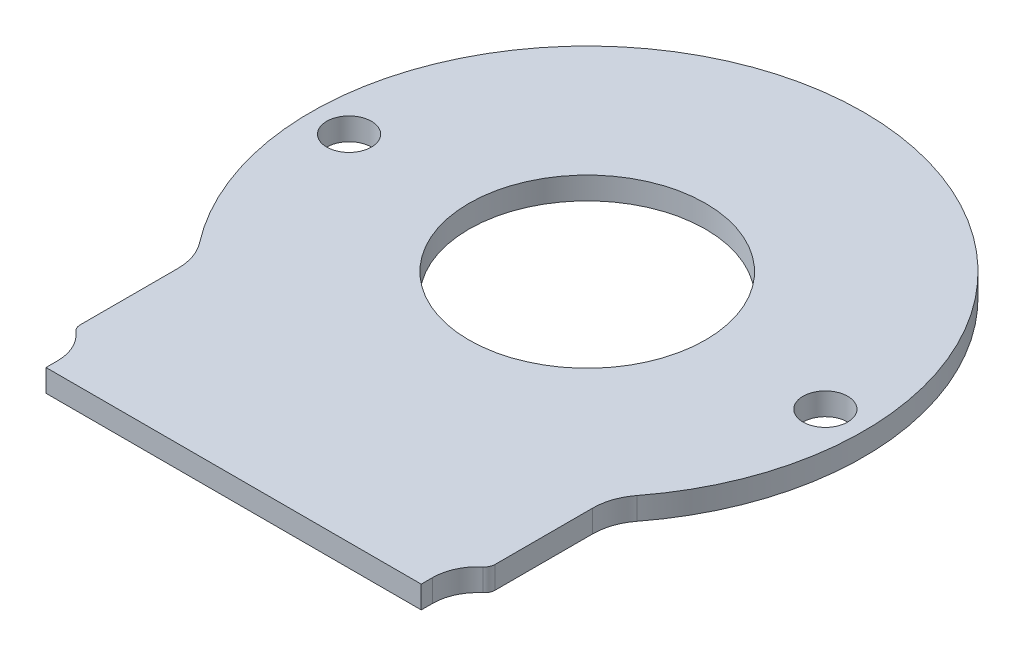
ISO-10303-21;
HEADER;
FILE_DESCRIPTION(('STEP AP214'),'2;1');
FILE_NAME('part.step','',(''),(''),'','','');
FILE_SCHEMA(('AUTOMOTIVE_DESIGN { 1 0 10303 214 1 1 1 1 }'));
ENDSEC;
DATA;
#1=APPLICATION_CONTEXT('core data for automotive mechanical design processes');
#2=APPLICATION_PROTOCOL_DEFINITION('international standard','automotive_design',2000,#1);
#3=PRODUCT_CONTEXT('',#1,'mechanical');
#4=PRODUCT('Part','Part','',(#3));
#5=PRODUCT_RELATED_PRODUCT_CATEGORY('part','',(#4));
#6=PRODUCT_DEFINITION_FORMATION('','',#4);
#7=PRODUCT_DEFINITION_CONTEXT('part definition',#1,'design');
#8=PRODUCT_DEFINITION('design','',#6,#7);
#9=PRODUCT_DEFINITION_SHAPE('','',#8);
#10=(LENGTH_UNIT() NAMED_UNIT(*) SI_UNIT(.MILLI.,.METRE.));
#11=(NAMED_UNIT(*) PLANE_ANGLE_UNIT() SI_UNIT($,.RADIAN.));
#12=(NAMED_UNIT(*) SI_UNIT($,.STERADIAN.) SOLID_ANGLE_UNIT());
#13=UNCERTAINTY_MEASURE_WITH_UNIT(LENGTH_MEASURE(1.E-05),#10,'distance_accuracy_value','');
#14=(GEOMETRIC_REPRESENTATION_CONTEXT(3) GLOBAL_UNCERTAINTY_ASSIGNED_CONTEXT((#13)) GLOBAL_UNIT_ASSIGNED_CONTEXT((#10,
#11,#12)) REPRESENTATION_CONTEXT('',''));
#15=CARTESIAN_POINT('',(0.,0.,0.));
#16=DIRECTION('',(0.,0.,1.));
#17=DIRECTION('',(1.,0.,0.));
#18=AXIS2_PLACEMENT_3D('',#15,#16,#17);
#19=CARTESIAN_POINT('',(0.,3.6576,0.));
#20=DIRECTION('',(0.,1.,0.));
#21=DIRECTION('',(-1.,0.,0.));
#22=AXIS2_PLACEMENT_3D('',#19,#20,#21);
#23=PLANE('',#22);
#24=CARTESIAN_POINT('',(8.382,3.6576,0.));
#25=DIRECTION('',(0.,1.,0.));
#26=DIRECTION('',(-1.,0.,0.));
#27=AXIS2_PLACEMENT_3D('',#24,#25,#26);
#28=CIRCLE('',#27,0.7874);
#29=CARTESIAN_POINT('',(7.5946,3.6576,0.));
#30=VERTEX_POINT('',#29);
#31=EDGE_CURVE('E184',#30,#30,#28,.T.);
#32=ORIENTED_EDGE('',*,*,#31,.T.);
#33=EDGE_LOOP('',(#32));
#34=FACE_BOUND('',#33,.T.);
#35=CARTESIAN_POINT('',(-8.382,3.6576,0.));
#36=DIRECTION('',(0.,1.,0.));
#37=DIRECTION('',(-1.,0.,0.));
#38=AXIS2_PLACEMENT_3D('',#35,#36,#37);
#39=CIRCLE('',#38,0.7874);
#40=CARTESIAN_POINT('',(-9.1694,3.6576,0.));
#41=VERTEX_POINT('',#40);
#42=EDGE_CURVE('E187',#41,#41,#39,.T.);
#43=ORIENTED_EDGE('',*,*,#42,.T.);
#44=EDGE_LOOP('',(#43));
#45=FACE_BOUND('',#44,.T.);
#46=CARTESIAN_POINT('',(0.,3.6576,0.));
#47=DIRECTION('',(0.,-1.,0.));
#48=DIRECTION('',(1.,0.,0.));
#49=AXIS2_PLACEMENT_3D('',#46,#47,#48);
#50=CIRCLE('',#49,4.1656);
#51=CARTESIAN_POINT('',(4.1656,3.6576,0.));
#52=VERTEX_POINT('',#51);
#53=EDGE_CURVE('E140',#52,#52,#50,.F.);
#54=ORIENTED_EDGE('',*,*,#53,.T.);
#55=EDGE_LOOP('',(#54));
#56=FACE_BOUND('',#55,.T.);
#57=CARTESIAN_POINT('',(6.9215,3.6576,10.541));
#58=DIRECTION('',(0.,-1.,0.));
#59=DIRECTION('',(1.,0.,0.));
#60=AXIS2_PLACEMENT_3D('',#57,#58,#59);
#61=CIRCLE('',#60,0.381);
#62=CARTESIAN_POINT('',(7.1673064516129,3.6576,10.8321016804237));
#63=VERTEX_POINT('',#62);
#64=CARTESIAN_POINT('',(7.3025,3.6576,10.541));
#65=VERTEX_POINT('',#64);
#66=EDGE_CURVE('E118',#63,#65,#61,.F.);
#67=ORIENTED_EDGE('',*,*,#66,.F.);
#68=CARTESIAN_POINT('',(8.1915,3.6576,12.0450253488555));
#69=DIRECTION('',(0.,-1.,0.));
#70=DIRECTION('',(1.,0.,0.));
#71=AXIS2_PLACEMENT_3D('',#68,#69,#70);
#72=CIRCLE('',#71,1.5875);
#73=CARTESIAN_POINT('',(6.604,3.6576,12.0450253488555));
#74=VERTEX_POINT('',#73);
#75=EDGE_CURVE('E20',#63,#74,#72,.F.);
#76=ORIENTED_EDGE('',*,*,#75,.T.);
#77=DIRECTION('',(0.,0.,1.));
#78=VECTOR('',#77,1.);
#79=CARTESIAN_POINT('',(6.604,3.6576,12.446));
#80=LINE('',#79,#78);
#81=CARTESIAN_POINT('',(6.604,3.6576,12.446));
#82=VERTEX_POINT('',#81);
#83=EDGE_CURVE('E107',#74,#82,#80,.T.);
#84=ORIENTED_EDGE('',*,*,#83,.T.);
#85=DIRECTION('',(1.,0.,0.));
#86=VECTOR('',#85,1.);
#87=CARTESIAN_POINT('',(-7.3025,3.6576,12.446));
#88=LINE('',#87,#86);
#89=CARTESIAN_POINT('',(-6.604,3.6576,12.446));
#90=VERTEX_POINT('',#89);
#91=EDGE_CURVE('E138',#90,#82,#88,.T.);
#92=ORIENTED_EDGE('',*,*,#91,.F.);
#93=DIRECTION('',(0.,0.,-1.));
#94=VECTOR('',#93,1.);
#95=CARTESIAN_POINT('',(-6.604,3.6576,12.446));
#96=LINE('',#95,#94);
#97=CARTESIAN_POINT('',(-6.604,3.6576,12.0450253488555));
#98=VERTEX_POINT('',#97);
#99=EDGE_CURVE('E133',#90,#98,#96,.T.);
#100=ORIENTED_EDGE('',*,*,#99,.T.);
#101=CARTESIAN_POINT('',(-8.1915,3.6576,12.0450253488555));
#102=DIRECTION('',(0.,-1.,0.));
#103=DIRECTION('',(1.,0.,0.));
#104=AXIS2_PLACEMENT_3D('',#101,#102,#103);
#105=CIRCLE('',#104,1.5875);
#106=CARTESIAN_POINT('',(-7.16730645161291,3.6576,10.8321016804236));
#107=VERTEX_POINT('',#106);
#108=EDGE_CURVE('E135',#98,#107,#105,.F.);
#109=ORIENTED_EDGE('',*,*,#108,.T.);
#110=CARTESIAN_POINT('',(-6.9215,3.6576,10.541));
#111=DIRECTION('',(0.,-1.,0.));
#112=DIRECTION('',(1.,0.,0.));
#113=AXIS2_PLACEMENT_3D('',#110,#111,#112);
#114=CIRCLE('',#113,0.381);
#115=CARTESIAN_POINT('',(-7.3025,3.6576,10.541));
#116=VERTEX_POINT('',#115);
#117=EDGE_CURVE('E195',#116,#107,#114,.F.);
#118=ORIENTED_EDGE('',*,*,#117,.F.);
#119=DIRECTION('',(0.,0.,1.));
#120=VECTOR('',#119,1.);
#121=CARTESIAN_POINT('',(-7.3025,3.6576,6.42739208310803));
#122=LINE('',#121,#120);
#123=CARTESIAN_POINT('',(-7.3025,3.6576,7.11008340246442));
#124=VERTEX_POINT('',#123);
#125=EDGE_CURVE('E145',#124,#116,#122,.T.);
#126=ORIENTED_EDGE('',*,*,#125,.F.);
#127=CARTESIAN_POINT('',(-9.2075,3.6576,7.11008340246442));
#128=DIRECTION('',(0.,-1.,0.));
#129=DIRECTION('',(1.,0.,0.));
#130=AXIS2_PLACEMENT_3D('',#127,#128,#129);
#131=CIRCLE('',#130,1.905);
#132=CARTESIAN_POINT('',(-7.69972161572053,3.6576,5.94576843481194));
#133=VERTEX_POINT('',#132);
#134=EDGE_CURVE('E198',#124,#133,#131,.F.);
#135=ORIENTED_EDGE('',*,*,#134,.T.);
#136=CARTESIAN_POINT('',(0.,3.6576,0.));
#137=DIRECTION('',(0.,-1.,0.));
#138=DIRECTION('',(1.,0.,0.));
#139=AXIS2_PLACEMENT_3D('',#136,#137,#138);
#140=CIRCLE('',#139,9.7282);
#141=CARTESIAN_POINT('',(7.69972161572052,3.6576,5.94576843481195));
#142=VERTEX_POINT('',#141);
#143=EDGE_CURVE('E200',#142,#133,#140,.F.);
#144=ORIENTED_EDGE('',*,*,#143,.F.);
#145=CARTESIAN_POINT('',(9.2075,3.6576,7.11008340246442));
#146=DIRECTION('',(0.,-1.,0.));
#147=DIRECTION('',(1.,0.,0.));
#148=AXIS2_PLACEMENT_3D('',#145,#146,#147);
#149=CIRCLE('',#148,1.905);
#150=CARTESIAN_POINT('',(7.3025,3.6576,7.11008340246442));
#151=VERTEX_POINT('',#150);
#152=EDGE_CURVE('E152',#142,#151,#149,.F.);
#153=ORIENTED_EDGE('',*,*,#152,.T.);
#154=DIRECTION('',(0.,0.,-1.));
#155=VECTOR('',#154,1.);
#156=CARTESIAN_POINT('',(7.3025,3.6576,12.446));
#157=LINE('',#156,#155);
#158=EDGE_CURVE('E150',#65,#151,#157,.T.);
#159=ORIENTED_EDGE('',*,*,#158,.F.);
#160=EDGE_LOOP('',(#67,#76,#84,#92,#100,#109,#118,#126,#135,#144,#153,#159));
#161=FACE_BOUND('',#160,.T.);
#162=ADVANCED_FACE('F17',(#34,#45,#56,#161),#23,.F.);
#163=CARTESIAN_POINT('',(6.604,3.6566,12.446));
#164=DIRECTION('',(-1.,0.,0.));
#165=DIRECTION('',(0.,0.,1.));
#166=AXIS2_PLACEMENT_3D('',#163,#164,#165);
#167=PLANE('',#166);
#168=DIRECTION('',(0.,-1.,0.));
#169=VECTOR('',#168,1.);
#170=CARTESIAN_POINT('',(6.604,3.6566,12.0450253488555));
#171=LINE('',#170,#169);
#172=CARTESIAN_POINT('',(6.604,4.445,12.0450253488555));
#173=VERTEX_POINT('',#172);
#174=EDGE_CURVE('E109',#74,#173,#171,.F.);
#175=ORIENTED_EDGE('',*,*,#174,.T.);
#176=DIRECTION('',(0.,0.,1.));
#177=VECTOR('',#176,1.);
#178=CARTESIAN_POINT('',(6.604,4.445,0.));
#179=LINE('',#178,#177);
#180=CARTESIAN_POINT('',(6.604,4.445,12.446));
#181=VERTEX_POINT('',#180);
#182=EDGE_CURVE('E183',#181,#173,#179,.F.);
#183=ORIENTED_EDGE('',*,*,#182,.F.);
#184=DIRECTION('',(0.,1.,0.));
#185=VECTOR('',#184,1.);
#186=CARTESIAN_POINT('',(6.604,20.2415080399839,12.446));
#187=LINE('',#186,#185);
#188=EDGE_CURVE('E112',#82,#181,#187,.T.);
#189=ORIENTED_EDGE('',*,*,#188,.F.);
#190=ORIENTED_EDGE('',*,*,#83,.F.);
#191=EDGE_LOOP('',(#175,#183,#189,#190));
#192=FACE_BOUND('',#191,.T.);
#193=ADVANCED_FACE('F108',(#192),#167,.F.);
#194=CARTESIAN_POINT('',(8.1915,3.6566,12.0450253488555));
#195=DIRECTION('',(0.,-1.,0.));
#196=DIRECTION('',(1.,0.,0.));
#197=AXIS2_PLACEMENT_3D('',#194,#195,#196);
#198=CYLINDRICAL_SURFACE('',#197,1.5875);
#199=DIRECTION('',(0.,-1.,0.));
#200=VECTOR('',#199,1.);
#201=CARTESIAN_POINT('',(7.1673064516129,3.6566,10.8321016804237));
#202=LINE('',#201,#200);
#203=CARTESIAN_POINT('',(7.1673064516129,4.445,10.8321016804237));
#204=VERTEX_POINT('',#203);
#205=EDGE_CURVE('E120',#204,#63,#202,.T.);
#206=ORIENTED_EDGE('',*,*,#205,.F.);
#207=CARTESIAN_POINT('',(8.1915,4.445,12.0450253488555));
#208=DIRECTION('',(0.,-1.,0.));
#209=DIRECTION('',(1.,0.,0.));
#210=AXIS2_PLACEMENT_3D('',#207,#208,#209);
#211=CIRCLE('',#210,1.5875);
#212=EDGE_CURVE('E123',#173,#204,#211,.T.);
#213=ORIENTED_EDGE('',*,*,#212,.F.);
#214=ORIENTED_EDGE('',*,*,#174,.F.);
#215=ORIENTED_EDGE('',*,*,#75,.F.);
#216=EDGE_LOOP('',(#206,#213,#214,#215));
#217=FACE_BOUND('',#216,.T.);
#218=ADVANCED_FACE('F121',(#217),#198,.F.);
#219=CARTESIAN_POINT('',(6.9215,3.6566,10.541));
#220=DIRECTION('',(0.,-1.,0.));
#221=DIRECTION('',(1.,0.,0.));
#222=AXIS2_PLACEMENT_3D('',#219,#220,#221);
#223=CYLINDRICAL_SURFACE('',#222,0.381);
#224=ORIENTED_EDGE('',*,*,#66,.T.);
#225=DIRECTION('',(0.,1.,0.));
#226=VECTOR('',#225,1.);
#227=CARTESIAN_POINT('',(7.3025,20.2415080399839,10.541));
#228=LINE('',#227,#226);
#229=CARTESIAN_POINT('',(7.3025,4.445,10.541));
#230=VERTEX_POINT('',#229);
#231=EDGE_CURVE('E153',#230,#65,#228,.F.);
#232=ORIENTED_EDGE('',*,*,#231,.F.);
#233=CARTESIAN_POINT('',(6.9215,4.445,10.541));
#234=DIRECTION('',(0.,-1.,0.));
#235=DIRECTION('',(1.,0.,0.));
#236=AXIS2_PLACEMENT_3D('',#233,#234,#235);
#237=CIRCLE('',#236,0.381);
#238=EDGE_CURVE('E179',#204,#230,#237,.F.);
#239=ORIENTED_EDGE('',*,*,#238,.F.);
#240=ORIENTED_EDGE('',*,*,#205,.T.);
#241=EDGE_LOOP('',(#224,#232,#239,#240));
#242=FACE_BOUND('',#241,.T.);
#243=ADVANCED_FACE('F208',(#242),#223,.T.);
#244=CARTESIAN_POINT('',(7.3025,20.2415080399839,12.446));
#245=DIRECTION('',(1.,0.,0.));
#246=DIRECTION('',(0.,0.,-1.));
#247=AXIS2_PLACEMENT_3D('',#244,#245,#246);
#248=PLANE('',#247);
#249=ORIENTED_EDGE('',*,*,#158,.T.);
#250=DIRECTION('',(0.,-1.,0.));
#251=VECTOR('',#250,1.);
#252=CARTESIAN_POINT('',(7.3025,4.445,7.11008340246442));
#253=LINE('',#252,#251);
#254=CARTESIAN_POINT('',(7.3025,4.445,7.11008340246442));
#255=VERTEX_POINT('',#254);
#256=EDGE_CURVE('E204',#151,#255,#253,.F.);
#257=ORIENTED_EDGE('',*,*,#256,.T.);
#258=DIRECTION('',(0.,0.,1.));
#259=VECTOR('',#258,1.);
#260=CARTESIAN_POINT('',(7.3025,4.445,0.));
#261=LINE('',#260,#259);
#262=EDGE_CURVE('E178',#230,#255,#261,.F.);
#263=ORIENTED_EDGE('',*,*,#262,.F.);
#264=ORIENTED_EDGE('',*,*,#231,.T.);
#265=EDGE_LOOP('',(#249,#257,#263,#264));
#266=FACE_BOUND('',#265,.T.);
#267=ADVANCED_FACE('F239',(#266),#248,.T.);
#268=CARTESIAN_POINT('',(9.2075,4.445,7.11008340246442));
#269=DIRECTION('',(0.,-1.,0.));
#270=DIRECTION('',(1.,0.,0.));
#271=AXIS2_PLACEMENT_3D('',#268,#269,#270);
#272=CYLINDRICAL_SURFACE('',#271,1.905);
#273=ORIENTED_EDGE('',*,*,#256,.F.);
#274=ORIENTED_EDGE('',*,*,#152,.F.);
#275=DIRECTION('',(0.,-1.,0.));
#276=VECTOR('',#275,1.);
#277=CARTESIAN_POINT('',(7.69972161572052,4.445,5.94576843481195));
#278=LINE('',#277,#276);
#279=CARTESIAN_POINT('',(7.69972161572052,4.445,5.94576843481195));
#280=VERTEX_POINT('',#279);
#281=EDGE_CURVE('E203',#280,#142,#278,.T.);
#282=ORIENTED_EDGE('',*,*,#281,.F.);
#283=CARTESIAN_POINT('',(9.2075,4.445,7.11008340246442));
#284=DIRECTION('',(0.,-1.,0.));
#285=DIRECTION('',(1.,0.,0.));
#286=AXIS2_PLACEMENT_3D('',#283,#284,#285);
#287=CIRCLE('',#286,1.905);
#288=EDGE_CURVE('E175',#255,#280,#287,.T.);
#289=ORIENTED_EDGE('',*,*,#288,.F.);
#290=EDGE_LOOP('',(#273,#274,#282,#289));
#291=FACE_BOUND('',#290,.T.);
#292=ADVANCED_FACE('F241',(#291),#272,.F.);
#293=CARTESIAN_POINT('',(0.,4.445,0.));
#294=DIRECTION('',(0.,-1.,0.));
#295=DIRECTION('',(1.,0.,0.));
#296=AXIS2_PLACEMENT_3D('',#293,#294,#295);
#297=CYLINDRICAL_SURFACE('',#296,9.7282);
#298=ORIENTED_EDGE('',*,*,#143,.T.);
#299=DIRECTION('',(0.,-1.,0.));
#300=VECTOR('',#299,1.);
#301=CARTESIAN_POINT('',(-7.69972161572053,4.445,5.94576843481194));
#302=LINE('',#301,#300);
#303=CARTESIAN_POINT('',(-7.69972161572053,4.445,5.94576843481194));
#304=VERTEX_POINT('',#303);
#305=EDGE_CURVE('E149',#133,#304,#302,.F.);
#306=ORIENTED_EDGE('',*,*,#305,.T.);
#307=CARTESIAN_POINT('',(0.,4.445,0.));
#308=DIRECTION('',(0.,-1.,0.));
#309=DIRECTION('',(1.,0.,0.));
#310=AXIS2_PLACEMENT_3D('',#307,#308,#309);
#311=CIRCLE('',#310,9.7282);
#312=EDGE_CURVE('E172',#280,#304,#311,.F.);
#313=ORIENTED_EDGE('',*,*,#312,.F.);
#314=ORIENTED_EDGE('',*,*,#281,.T.);
#315=EDGE_LOOP('',(#298,#306,#313,#314));
#316=FACE_BOUND('',#315,.T.);
#317=ADVANCED_FACE('F246',(#316),#297,.T.);
#318=CARTESIAN_POINT('',(-9.2075,4.445,7.11008340246442));
#319=DIRECTION('',(0.,-1.,0.));
#320=DIRECTION('',(1.,0.,0.));
#321=AXIS2_PLACEMENT_3D('',#318,#319,#320);
#322=CYLINDRICAL_SURFACE('',#321,1.905);
#323=ORIENTED_EDGE('',*,*,#305,.F.);
#324=ORIENTED_EDGE('',*,*,#134,.F.);
#325=DIRECTION('',(0.,1.,0.));
#326=VECTOR('',#325,1.);
#327=CARTESIAN_POINT('',(-7.3025,20.2415080399839,7.11008340246442));
#328=LINE('',#327,#326);
#329=CARTESIAN_POINT('',(-7.3025,4.445,7.11008340246442));
#330=VERTEX_POINT('',#329);
#331=EDGE_CURVE('E148',#330,#124,#328,.F.);
#332=ORIENTED_EDGE('',*,*,#331,.F.);
#333=CARTESIAN_POINT('',(-9.2075,4.445,7.11008340246442));
#334=DIRECTION('',(0.,-1.,0.));
#335=DIRECTION('',(1.,0.,0.));
#336=AXIS2_PLACEMENT_3D('',#333,#334,#335);
#337=CIRCLE('',#336,1.905);
#338=EDGE_CURVE('E169',#304,#330,#337,.T.);
#339=ORIENTED_EDGE('',*,*,#338,.F.);
#340=EDGE_LOOP('',(#323,#324,#332,#339));
#341=FACE_BOUND('',#340,.T.);
#342=ADVANCED_FACE('F251',(#341),#322,.F.);
#343=CARTESIAN_POINT('',(-7.3025,20.2415080399839,6.42739208310803));
#344=DIRECTION('',(-1.,0.,0.));
#345=DIRECTION('',(0.,0.,1.));
#346=AXIS2_PLACEMENT_3D('',#343,#344,#345);
#347=PLANE('',#346);
#348=DIRECTION('',(0.,0.,1.));
#349=VECTOR('',#348,1.);
#350=CARTESIAN_POINT('',(-7.3025,4.445,0.));
#351=LINE('',#350,#349);
#352=CARTESIAN_POINT('',(-7.3025,4.445,10.541));
#353=VERTEX_POINT('',#352);
#354=EDGE_CURVE('E168',#330,#353,#351,.T.);
#355=ORIENTED_EDGE('',*,*,#354,.F.);
#356=ORIENTED_EDGE('',*,*,#331,.T.);
#357=ORIENTED_EDGE('',*,*,#125,.T.);
#358=DIRECTION('',(0.,-1.,0.));
#359=VECTOR('',#358,1.);
#360=CARTESIAN_POINT('',(-7.3025,20.2415080399839,10.541));
#361=LINE('',#360,#359);
#362=EDGE_CURVE('E197',#353,#116,#361,.T.);
#363=ORIENTED_EDGE('',*,*,#362,.F.);
#364=EDGE_LOOP('',(#355,#356,#357,#363));
#365=FACE_BOUND('',#364,.T.);
#366=ADVANCED_FACE('F254',(#365),#347,.T.);
#367=CARTESIAN_POINT('',(-6.9215,20.2415080399839,10.541));
#368=DIRECTION('',(0.,-1.,0.));
#369=DIRECTION('',(1.,0.,0.));
#370=AXIS2_PLACEMENT_3D('',#367,#368,#369);
#371=CYLINDRICAL_SURFACE('',#370,0.381);
#372=CARTESIAN_POINT('',(-6.9215,4.445,10.541));
#373=DIRECTION('',(0.,-1.,0.));
#374=DIRECTION('',(1.,0.,0.));
#375=AXIS2_PLACEMENT_3D('',#372,#373,#374);
#376=CIRCLE('',#375,0.381);
#377=CARTESIAN_POINT('',(-7.16730645161291,4.445,10.8321016804236));
#378=VERTEX_POINT('',#377);
#379=EDGE_CURVE('E165',#353,#378,#376,.F.);
#380=ORIENTED_EDGE('',*,*,#379,.F.);
#381=ORIENTED_EDGE('',*,*,#362,.T.);
#382=ORIENTED_EDGE('',*,*,#117,.T.);
#383=DIRECTION('',(0.,-1.,0.));
#384=VECTOR('',#383,1.);
#385=CARTESIAN_POINT('',(-7.16730645161291,20.2415080399839,10.8321016804236));
#386=LINE('',#385,#384);
#387=EDGE_CURVE('E194',#107,#378,#386,.F.);
#388=ORIENTED_EDGE('',*,*,#387,.T.);
#389=EDGE_LOOP('',(#380,#381,#382,#388));
#390=FACE_BOUND('',#389,.T.);
#391=ADVANCED_FACE('F328',(#390),#371,.T.);
#392=CARTESIAN_POINT('',(-8.1915,20.2415080399839,12.0450253488555));
#393=DIRECTION('',(0.,-1.,0.));
#394=DIRECTION('',(1.,0.,0.));
#395=AXIS2_PLACEMENT_3D('',#392,#393,#394);
#396=CYLINDRICAL_SURFACE('',#395,1.5875);
#397=DIRECTION('',(0.,1.,0.));
#398=VECTOR('',#397,1.);
#399=CARTESIAN_POINT('',(-6.604,3.6566,12.0450253488555));
#400=LINE('',#399,#398);
#401=CARTESIAN_POINT('',(-6.604,4.445,12.0450253488555));
#402=VERTEX_POINT('',#401);
#403=EDGE_CURVE('E130',#98,#402,#400,.T.);
#404=ORIENTED_EDGE('',*,*,#403,.T.);
#405=CARTESIAN_POINT('',(-8.1915,4.445,12.0450253488555));
#406=DIRECTION('',(0.,-1.,0.));
#407=DIRECTION('',(1.,0.,0.));
#408=AXIS2_PLACEMENT_3D('',#405,#406,#407);
#409=CIRCLE('',#408,1.5875);
#410=EDGE_CURVE('E161',#378,#402,#409,.T.);
#411=ORIENTED_EDGE('',*,*,#410,.F.);
#412=ORIENTED_EDGE('',*,*,#387,.F.);
#413=ORIENTED_EDGE('',*,*,#108,.F.);
#414=EDGE_LOOP('',(#404,#411,#412,#413));
#415=FACE_BOUND('',#414,.T.);
#416=ADVANCED_FACE('F264',(#415),#396,.F.);
#417=CARTESIAN_POINT('',(-6.604,3.6566,12.446));
#418=DIRECTION('',(1.,0.,0.));
#419=DIRECTION('',(0.,0.,-1.));
#420=AXIS2_PLACEMENT_3D('',#417,#418,#419);
#421=PLANE('',#420);
#422=ORIENTED_EDGE('',*,*,#403,.F.);
#423=ORIENTED_EDGE('',*,*,#99,.F.);
#424=DIRECTION('',(0.,1.,0.));
#425=VECTOR('',#424,1.);
#426=CARTESIAN_POINT('',(-6.604,20.2415080399839,12.446));
#427=LINE('',#426,#425);
#428=CARTESIAN_POINT('',(-6.604,4.445,12.446));
#429=VERTEX_POINT('',#428);
#430=EDGE_CURVE('E35',#429,#90,#427,.F.);
#431=ORIENTED_EDGE('',*,*,#430,.F.);
#432=DIRECTION('',(0.,0.,1.));
#433=VECTOR('',#432,1.);
#434=CARTESIAN_POINT('',(-6.604,4.445,0.));
#435=LINE('',#434,#433);
#436=EDGE_CURVE('E164',#402,#429,#435,.T.);
#437=ORIENTED_EDGE('',*,*,#436,.F.);
#438=EDGE_LOOP('',(#422,#423,#431,#437));
#439=FACE_BOUND('',#438,.T.);
#440=ADVANCED_FACE('F261',(#439),#421,.F.);
#441=CARTESIAN_POINT('',(-7.3025,20.2415080399839,12.446));
#442=DIRECTION('',(0.,0.,1.));
#443=DIRECTION('',(1.,0.,0.));
#444=AXIS2_PLACEMENT_3D('',#441,#442,#443);
#445=PLANE('',#444);
#446=ORIENTED_EDGE('',*,*,#430,.T.);
#447=ORIENTED_EDGE('',*,*,#91,.T.);
#448=ORIENTED_EDGE('',*,*,#188,.T.);
#449=DIRECTION('',(-1.,0.,0.));
#450=VECTOR('',#449,1.);
#451=CARTESIAN_POINT('',(0.,4.445,12.446));
#452=LINE('',#451,#450);
#453=EDGE_CURVE('E160',#429,#181,#452,.F.);
#454=ORIENTED_EDGE('',*,*,#453,.F.);
#455=EDGE_LOOP('',(#446,#447,#448,#454));
#456=FACE_BOUND('',#455,.T.);
#457=ADVANCED_FACE('F267',(#456),#445,.T.);
#458=CARTESIAN_POINT('',(0.,4.445,0.));
#459=DIRECTION('',(0.,-1.,0.));
#460=DIRECTION('',(1.,0.,0.));
#461=AXIS2_PLACEMENT_3D('',#458,#459,#460);
#462=CYLINDRICAL_SURFACE('',#461,4.1656);
#463=ORIENTED_EDGE('',*,*,#53,.F.);
#464=EDGE_LOOP('',(#463));
#465=FACE_BOUND('',#464,.T.);
#466=CARTESIAN_POINT('',(0.,4.445,0.));
#467=DIRECTION('',(0.,-1.,0.));
#468=DIRECTION('',(1.,0.,0.));
#469=AXIS2_PLACEMENT_3D('',#466,#467,#468);
#470=CIRCLE('',#469,4.1656);
#471=CARTESIAN_POINT('',(4.1656,4.445,0.));
#472=VERTEX_POINT('',#471);
#473=EDGE_CURVE('E157',#472,#472,#470,.T.);
#474=ORIENTED_EDGE('',*,*,#473,.F.);
#475=EDGE_LOOP('',(#474));
#476=FACE_BOUND('',#475,.T.);
#477=ADVANCED_FACE('F269',(#465,#476),#462,.F.);
#478=CARTESIAN_POINT('',(-8.382,3.6576,0.));
#479=DIRECTION('',(0.,1.,0.));
#480=DIRECTION('',(-1.,0.,0.));
#481=AXIS2_PLACEMENT_3D('',#478,#479,#480);
#482=CYLINDRICAL_SURFACE('',#481,0.7874);
#483=CARTESIAN_POINT('',(-8.382,4.445,0.));
#484=DIRECTION('',(0.,1.,0.));
#485=DIRECTION('',(-1.,0.,0.));
#486=AXIS2_PLACEMENT_3D('',#483,#484,#485);
#487=CIRCLE('',#486,0.7874);
#488=CARTESIAN_POINT('',(-9.1694,4.445,0.));
#489=VERTEX_POINT('',#488);
#490=EDGE_CURVE('E26',#489,#489,#487,.F.);
#491=ORIENTED_EDGE('',*,*,#490,.F.);
#492=EDGE_LOOP('',(#491));
#493=FACE_BOUND('',#492,.T.);
#494=ORIENTED_EDGE('',*,*,#42,.F.);
#495=EDGE_LOOP('',(#494));
#496=FACE_BOUND('',#495,.T.);
#497=ADVANCED_FACE('F276',(#493,#496),#482,.F.);
#498=CARTESIAN_POINT('',(8.382,3.6576,0.));
#499=DIRECTION('',(0.,1.,0.));
#500=DIRECTION('',(-1.,0.,0.));
#501=AXIS2_PLACEMENT_3D('',#498,#499,#500);
#502=CYLINDRICAL_SURFACE('',#501,0.7874);
#503=CARTESIAN_POINT('',(8.382,4.445,0.));
#504=DIRECTION('',(0.,1.,0.));
#505=DIRECTION('',(-1.,0.,0.));
#506=AXIS2_PLACEMENT_3D('',#503,#504,#505);
#507=CIRCLE('',#506,0.7874);
#508=CARTESIAN_POINT('',(7.5946,4.445,0.));
#509=VERTEX_POINT('',#508);
#510=EDGE_CURVE('E11',#509,#509,#507,.F.);
#511=ORIENTED_EDGE('',*,*,#510,.F.);
#512=EDGE_LOOP('',(#511));
#513=FACE_BOUND('',#512,.T.);
#514=ORIENTED_EDGE('',*,*,#31,.F.);
#515=EDGE_LOOP('',(#514));
#516=FACE_BOUND('',#515,.T.);
#517=ADVANCED_FACE('F281',(#513,#516),#502,.F.);
#518=CARTESIAN_POINT('',(0.,4.445,0.));
#519=DIRECTION('',(0.,1.,0.));
#520=DIRECTION('',(-1.,0.,0.));
#521=AXIS2_PLACEMENT_3D('',#518,#519,#520);
#522=PLANE('',#521);
#523=ORIENTED_EDGE('',*,*,#510,.T.);
#524=EDGE_LOOP('',(#523));
#525=FACE_BOUND('',#524,.T.);
#526=ORIENTED_EDGE('',*,*,#490,.T.);
#527=EDGE_LOOP('',(#526));
#528=FACE_BOUND('',#527,.T.);
#529=ORIENTED_EDGE('',*,*,#473,.T.);
#530=EDGE_LOOP('',(#529));
#531=FACE_BOUND('',#530,.T.);
#532=ORIENTED_EDGE('',*,*,#436,.T.);
#533=ORIENTED_EDGE('',*,*,#453,.T.);
#534=ORIENTED_EDGE('',*,*,#182,.T.);
#535=ORIENTED_EDGE('',*,*,#212,.T.);
#536=ORIENTED_EDGE('',*,*,#238,.T.);
#537=ORIENTED_EDGE('',*,*,#262,.T.);
#538=ORIENTED_EDGE('',*,*,#288,.T.);
#539=ORIENTED_EDGE('',*,*,#312,.T.);
#540=ORIENTED_EDGE('',*,*,#338,.T.);
#541=ORIENTED_EDGE('',*,*,#354,.T.);
#542=ORIENTED_EDGE('',*,*,#379,.T.);
#543=ORIENTED_EDGE('',*,*,#410,.T.);
#544=EDGE_LOOP('',(#532,#533,#534,#535,#536,#537,#538,#539,#540,#541,#542,#543));
#545=FACE_BOUND('',#544,.T.);
#546=ADVANCED_FACE('F213',(#525,#528,#531,#545),#522,.T.);
#547=CLOSED_SHELL('',(#162,#193,#218,#243,#267,#292,#317,#342,#366,#391,#416,#440,#457,#477,
#497,#517,#546));
#548=MANIFOLD_SOLID_BREP('B1',#547);
#549=ADVANCED_BREP_SHAPE_REPRESENTATION('',(#18,#548),#14);
#550=SHAPE_DEFINITION_REPRESENTATION(#9,#549);
ENDSEC;
END-ISO-10303-21;
